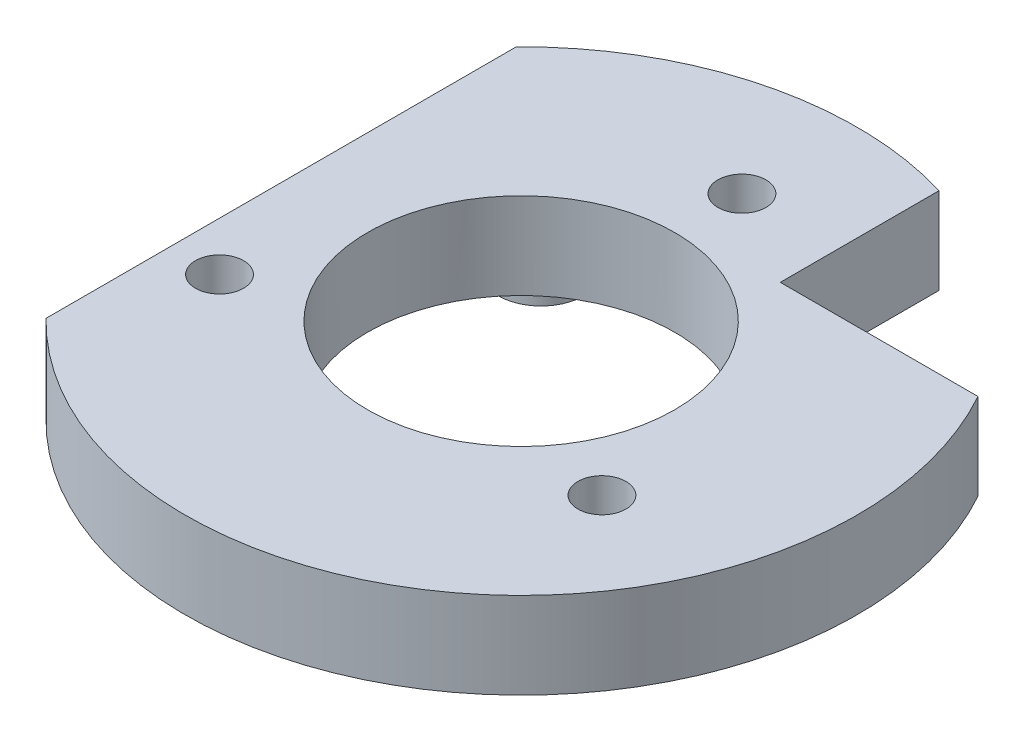
ISO-10303-21;
HEADER;
FILE_DESCRIPTION(('STEP AP214'),'2;1');
FILE_NAME('part.step','',(''),(''),'','','');
FILE_SCHEMA(('AUTOMOTIVE_DESIGN { 1 0 10303 214 1 1 1 1 }'));
ENDSEC;
DATA;
#1=APPLICATION_CONTEXT('core data for automotive mechanical design processes');
#2=APPLICATION_PROTOCOL_DEFINITION('international standard','automotive_design',2000,#1);
#3=PRODUCT_CONTEXT('',#1,'mechanical');
#4=PRODUCT('Part','Part','',(#3));
#5=PRODUCT_RELATED_PRODUCT_CATEGORY('part','',(#4));
#6=PRODUCT_DEFINITION_FORMATION('','',#4);
#7=PRODUCT_DEFINITION_CONTEXT('part definition',#1,'design');
#8=PRODUCT_DEFINITION('design','',#6,#7);
#9=PRODUCT_DEFINITION_SHAPE('','',#8);
#10=(LENGTH_UNIT() NAMED_UNIT(*) SI_UNIT(.MILLI.,.METRE.));
#11=(NAMED_UNIT(*) PLANE_ANGLE_UNIT() SI_UNIT($,.RADIAN.));
#12=(NAMED_UNIT(*) SI_UNIT($,.STERADIAN.) SOLID_ANGLE_UNIT());
#13=UNCERTAINTY_MEASURE_WITH_UNIT(LENGTH_MEASURE(1.E-05),#10,'distance_accuracy_value','');
#14=(GEOMETRIC_REPRESENTATION_CONTEXT(3) GLOBAL_UNCERTAINTY_ASSIGNED_CONTEXT((#13)) GLOBAL_UNIT_ASSIGNED_CONTEXT((#10,
#11,#12)) REPRESENTATION_CONTEXT('',''));
#15=CARTESIAN_POINT('',(0.,0.,0.));
#16=DIRECTION('',(0.,0.,1.));
#17=DIRECTION('',(1.,0.,0.));
#18=AXIS2_PLACEMENT_3D('',#15,#16,#17);
#19=CARTESIAN_POINT('',(0.,0.,0.));
#20=DIRECTION('',(0.,1.,0.));
#21=DIRECTION('',(1.,0.,0.));
#22=AXIS2_PLACEMENT_3D('',#19,#20,#21);
#23=PLANE('',#22);
#24=DIRECTION('',(0.,0.,1.));
#25=VECTOR('',#24,1.);
#26=CARTESIAN_POINT('',(-12.5,0.,-12.24744871392));
#27=LINE('',#26,#25);
#28=CARTESIAN_POINT('',(-12.5,0.,-12.24744871392));
#29=VERTEX_POINT('',#28);
#30=CARTESIAN_POINT('',(-12.5,0.,-11.29158979064));
#31=VERTEX_POINT('',#30);
#32=EDGE_CURVE('E95',#29,#31,#27,.T.);
#33=ORIENTED_EDGE('',*,*,#32,.F.);
#34=CARTESIAN_POINT('',(0.,0.,0.));
#35=DIRECTION('',(0.,1.,0.));
#36=DIRECTION('',(-0.672131147540977,0.,-0.740432117418774));
#37=AXIS2_PLACEMENT_3D('',#34,#35,#36);
#38=CIRCLE('',#37,17.5);
#39=CARTESIAN_POINT('',(-11.76229508197,0.,-12.95756205483));
#40=VERTEX_POINT('',#39);
#41=EDGE_CURVE('E36',#40,#29,#38,.T.);
#42=ORIENTED_EDGE('',*,*,#41,.F.);
#43=CARTESIAN_POINT('',(-10.25,0.,-11.29158979064));
#44=DIRECTION('',(0.,-1.,0.));
#45=DIRECTION('',(-1.,0.,0.));
#46=AXIS2_PLACEMENT_3D('',#43,#44,#45);
#47=CIRCLE('',#46,2.25);
#48=EDGE_CURVE('E125',#31,#40,#47,.T.);
#49=ORIENTED_EDGE('',*,*,#48,.F.);
#50=EDGE_LOOP('',(#33,#42,#49));
#51=FACE_BOUND('',#50,.T.);
#52=ADVANCED_FACE('F17',(#51),#23,.F.);
#53=CARTESIAN_POINT('',(0.,0.,0.));
#54=DIRECTION('',(0.,1.,0.));
#55=DIRECTION('',(1.,0.,0.));
#56=AXIS2_PLACEMENT_3D('',#53,#54,#55);
#57=PLANE('',#56);
#58=CARTESIAN_POINT('',(0.,0.,0.));
#59=DIRECTION('',(0.,1.,0.));
#60=DIRECTION('',(0.285714285714302,0.,-0.958314847499905));
#61=AXIS2_PLACEMENT_3D('',#58,#59,#60);
#62=CIRCLE('',#61,17.5);
#63=CARTESIAN_POINT('',(5.,0.,-16.77050983125));
#64=VERTEX_POINT('',#63);
#65=EDGE_CURVE('E93',#64,#40,#62,.T.);
#66=ORIENTED_EDGE('',*,*,#65,.F.);
#67=DIRECTION('',(0.,0.,-1.));
#68=VECTOR('',#67,1.);
#69=CARTESIAN_POINT('',(5.,0.,-8.5));
#70=LINE('',#69,#68);
#71=CARTESIAN_POINT('',(5.,0.,-8.5));
#72=VERTEX_POINT('',#71);
#73=EDGE_CURVE('E103',#72,#64,#70,.T.);
#74=ORIENTED_EDGE('',*,*,#73,.F.);
#75=DIRECTION('',(-1.,0.,0.));
#76=VECTOR('',#75,1.);
#77=CARTESIAN_POINT('',(15.29705854078,0.,-8.5));
#78=LINE('',#77,#76);
#79=CARTESIAN_POINT('',(15.29705854078,0.,-8.5));
#80=VERTEX_POINT('',#79);
#81=EDGE_CURVE('E106',#80,#72,#78,.T.);
#82=ORIENTED_EDGE('',*,*,#81,.F.);
#83=CARTESIAN_POINT('',(0.,0.,0.));
#84=DIRECTION('',(0.,1.,0.));
#85=DIRECTION('',(-0.71428571428569,0.,0.69985421222379));
#86=AXIS2_PLACEMENT_3D('',#83,#84,#85);
#87=CIRCLE('',#86,17.5);
#88=CARTESIAN_POINT('',(-12.5,0.,12.24744871392));
#89=VERTEX_POINT('',#88);
#90=EDGE_CURVE('E109',#89,#80,#87,.T.);
#91=ORIENTED_EDGE('',*,*,#90,.F.);
#92=DIRECTION('',(0.,0.,1.));
#93=VECTOR('',#92,1.);
#94=CARTESIAN_POINT('',(-12.5,0.,-11.29158979064));
#95=LINE('',#94,#93);
#96=EDGE_CURVE('E121',#31,#89,#95,.T.);
#97=ORIENTED_EDGE('',*,*,#96,.F.);
#98=CARTESIAN_POINT('',(-10.25,0.,-11.29158979064));
#99=DIRECTION('',(0.,-1.,0.));
#100=DIRECTION('',(1.,0.,0.));
#101=AXIS2_PLACEMENT_3D('',#98,#99,#100);
#102=CIRCLE('',#101,2.25);
#103=EDGE_CURVE('E123',#40,#31,#102,.T.);
#104=ORIENTED_EDGE('',*,*,#103,.F.);
#105=EDGE_LOOP('',(#66,#74,#82,#91,#97,#104));
#106=FACE_BOUND('',#105,.T.);
#107=CARTESIAN_POINT('',(0.,0.,0.));
#108=DIRECTION('',(0.,-1.,0.));
#109=DIRECTION('',(-1.,0.,0.));
#110=AXIS2_PLACEMENT_3D('',#107,#108,#109);
#111=CIRCLE('',#110,8.);
#112=CARTESIAN_POINT('',(-8.,0.,0.));
#113=VERTEX_POINT('',#112);
#114=EDGE_CURVE('E126',#113,#113,#111,.T.);
#115=ORIENTED_EDGE('',*,*,#114,.F.);
#116=EDGE_LOOP('',(#115));
#117=FACE_BOUND('',#116,.T.);
#118=CARTESIAN_POINT('',(0.,0.,-11.5));
#119=DIRECTION('',(0.,1.,0.));
#120=DIRECTION('',(1.,0.,0.));
#121=AXIS2_PLACEMENT_3D('',#118,#119,#120);
#122=CIRCLE('',#121,1.25);
#123=CARTESIAN_POINT('',(1.25,0.,-11.5));
#124=VERTEX_POINT('',#123);
#125=EDGE_CURVE('E11',#124,#124,#122,.T.);
#126=ORIENTED_EDGE('',*,*,#125,.T.);
#127=EDGE_LOOP('',(#126));
#128=FACE_BOUND('',#127,.T.);
#129=CARTESIAN_POINT('',(-9.959292143521,0.,5.75));
#130=DIRECTION('',(0.,1.,0.));
#131=DIRECTION('',(-0.500000000000017,0.,-0.866025403784429));
#132=AXIS2_PLACEMENT_3D('',#129,#130,#131);
#133=CIRCLE('',#132,1.25);
#134=CARTESIAN_POINT('',(-10.584292143521,0.,4.66746824526946));
#135=VERTEX_POINT('',#134);
#136=EDGE_CURVE('E27',#135,#135,#133,.T.);
#137=ORIENTED_EDGE('',*,*,#136,.T.);
#138=EDGE_LOOP('',(#137));
#139=FACE_BOUND('',#138,.T.);
#140=CARTESIAN_POINT('',(9.959292143521,0.,5.75));
#141=DIRECTION('',(0.,1.,0.));
#142=DIRECTION('',(-0.500000000000017,0.,0.866025403784429));
#143=AXIS2_PLACEMENT_3D('',#140,#141,#142);
#144=CIRCLE('',#143,1.25);
#145=CARTESIAN_POINT('',(9.33429214352098,0.,6.83253175473054));
#146=VERTEX_POINT('',#145);
#147=EDGE_CURVE('E128',#146,#146,#144,.T.);
#148=ORIENTED_EDGE('',*,*,#147,.T.);
#149=EDGE_LOOP('',(#148));
#150=FACE_BOUND('',#149,.T.);
#151=ADVANCED_FACE('F157',(#106,#117,#128,#139,#150),#57,.F.);
#152=CARTESIAN_POINT('',(0.,0.,0.));
#153=DIRECTION('',(0.,1.,0.));
#154=DIRECTION('',(1.,0.,0.));
#155=AXIS2_PLACEMENT_3D('',#152,#153,#154);
#156=CYLINDRICAL_SURFACE('',#155,8.);
#157=CARTESIAN_POINT('',(0.,4.5,0.));
#158=DIRECTION('',(0.,-1.,0.));
#159=DIRECTION('',(1.,0.,0.));
#160=AXIS2_PLACEMENT_3D('',#157,#158,#159);
#161=CIRCLE('',#160,8.);
#162=CARTESIAN_POINT('',(8.,4.5,0.));
#163=VERTEX_POINT('',#162);
#164=EDGE_CURVE('E84',#163,#163,#161,.T.);
#165=ORIENTED_EDGE('',*,*,#164,.F.);
#166=EDGE_LOOP('',(#165));
#167=FACE_BOUND('',#166,.T.);
#168=ORIENTED_EDGE('',*,*,#114,.T.);
#169=EDGE_LOOP('',(#168));
#170=FACE_BOUND('',#169,.T.);
#171=ADVANCED_FACE('F181',(#167,#170),#156,.F.);
#172=CARTESIAN_POINT('',(0.,4.5,0.));
#173=DIRECTION('',(0.,1.,0.));
#174=DIRECTION('',(1.,0.,0.));
#175=AXIS2_PLACEMENT_3D('',#172,#173,#174);
#176=PLANE('',#175);
#177=CARTESIAN_POINT('',(0.,4.5,0.));
#178=DIRECTION('',(0.,1.,0.));
#179=DIRECTION('',(-0.71428571428569,0.,0.69985421222379));
#180=AXIS2_PLACEMENT_3D('',#177,#178,#179);
#181=CIRCLE('',#180,17.5);
#182=CARTESIAN_POINT('',(-12.5,4.5,12.24744871392));
#183=VERTEX_POINT('',#182);
#184=CARTESIAN_POINT('',(15.29705854078,4.5,-8.5));
#185=VERTEX_POINT('',#184);
#186=EDGE_CURVE('E129',#183,#185,#181,.T.);
#187=ORIENTED_EDGE('',*,*,#186,.T.);
#188=DIRECTION('',(-1.,0.,0.));
#189=VECTOR('',#188,1.);
#190=CARTESIAN_POINT('',(15.29705854078,4.5,-8.5));
#191=LINE('',#190,#189);
#192=CARTESIAN_POINT('',(5.,4.5,-8.5));
#193=VERTEX_POINT('',#192);
#194=EDGE_CURVE('E138',#185,#193,#191,.T.);
#195=ORIENTED_EDGE('',*,*,#194,.T.);
#196=DIRECTION('',(0.,0.,-1.));
#197=VECTOR('',#196,1.);
#198=CARTESIAN_POINT('',(5.,4.5,-8.5));
#199=LINE('',#198,#197);
#200=CARTESIAN_POINT('',(5.,4.5,-16.77050983125));
#201=VERTEX_POINT('',#200);
#202=EDGE_CURVE('E89',#193,#201,#199,.T.);
#203=ORIENTED_EDGE('',*,*,#202,.T.);
#204=CARTESIAN_POINT('',(0.,4.5,0.));
#205=DIRECTION('',(0.,1.,0.));
#206=DIRECTION('',(0.285714285714302,0.,-0.958314847499905));
#207=AXIS2_PLACEMENT_3D('',#204,#205,#206);
#208=CIRCLE('',#207,17.5);
#209=CARTESIAN_POINT('',(-12.5,4.5,-12.24744871392));
#210=VERTEX_POINT('',#209);
#211=EDGE_CURVE('E68',#201,#210,#208,.T.);
#212=ORIENTED_EDGE('',*,*,#211,.T.);
#213=DIRECTION('',(0.,0.,1.));
#214=VECTOR('',#213,1.);
#215=CARTESIAN_POINT('',(-12.5,4.5,-12.24744871392));
#216=LINE('',#215,#214);
#217=EDGE_CURVE('E74',#210,#183,#216,.T.);
#218=ORIENTED_EDGE('',*,*,#217,.T.);
#219=EDGE_LOOP('',(#187,#195,#203,#212,#218));
#220=FACE_BOUND('',#219,.T.);
#221=ORIENTED_EDGE('',*,*,#164,.T.);
#222=EDGE_LOOP('',(#221));
#223=FACE_BOUND('',#222,.T.);
#224=CARTESIAN_POINT('',(0.,4.5,-11.5));
#225=DIRECTION('',(0.,1.,0.));
#226=DIRECTION('',(1.,0.,0.));
#227=AXIS2_PLACEMENT_3D('',#224,#225,#226);
#228=CIRCLE('',#227,1.25);
#229=CARTESIAN_POINT('',(1.25,4.5,-11.5));
#230=VERTEX_POINT('',#229);
#231=EDGE_CURVE('E113',#230,#230,#228,.T.);
#232=ORIENTED_EDGE('',*,*,#231,.F.);
#233=EDGE_LOOP('',(#232));
#234=FACE_BOUND('',#233,.T.);
#235=CARTESIAN_POINT('',(-9.959292143521,4.5,5.75));
#236=DIRECTION('',(0.,1.,0.));
#237=DIRECTION('',(-0.500000000000017,0.,-0.866025403784429));
#238=AXIS2_PLACEMENT_3D('',#235,#236,#237);
#239=CIRCLE('',#238,1.25);
#240=CARTESIAN_POINT('',(-10.584292143521,4.5,4.66746824526946));
#241=VERTEX_POINT('',#240);
#242=EDGE_CURVE('E117',#241,#241,#239,.T.);
#243=ORIENTED_EDGE('',*,*,#242,.F.);
#244=EDGE_LOOP('',(#243));
#245=FACE_BOUND('',#244,.T.);
#246=CARTESIAN_POINT('',(9.959292143521,4.5,5.75));
#247=DIRECTION('',(0.,1.,0.));
#248=DIRECTION('',(-0.500000000000017,0.,0.866025403784429));
#249=AXIS2_PLACEMENT_3D('',#246,#247,#248);
#250=CIRCLE('',#249,1.25);
#251=CARTESIAN_POINT('',(9.33429214352098,4.5,6.83253175473054));
#252=VERTEX_POINT('',#251);
#253=EDGE_CURVE('E142',#252,#252,#250,.T.);
#254=ORIENTED_EDGE('',*,*,#253,.F.);
#255=EDGE_LOOP('',(#254));
#256=FACE_BOUND('',#255,.T.);
#257=ADVANCED_FACE('F86',(#220,#223,#234,#245,#256),#176,.T.);
#258=CARTESIAN_POINT('',(-12.5,0.,-12.24744871392));
#259=DIRECTION('',(-1.,0.,0.));
#260=DIRECTION('',(0.,0.,1.));
#261=AXIS2_PLACEMENT_3D('',#258,#259,#260);
#262=PLANE('',#261);
#263=ORIENTED_EDGE('',*,*,#96,.T.);
#264=DIRECTION('',(0.,1.,0.));
#265=VECTOR('',#264,1.);
#266=CARTESIAN_POINT('',(-12.5,0.,12.24744871392));
#267=LINE('',#266,#265);
#268=EDGE_CURVE('E80',#89,#183,#267,.T.);
#269=ORIENTED_EDGE('',*,*,#268,.T.);
#270=ORIENTED_EDGE('',*,*,#217,.F.);
#271=DIRECTION('',(0.,1.,0.));
#272=VECTOR('',#271,1.);
#273=CARTESIAN_POINT('',(-12.5,0.,-12.24744871392));
#274=LINE('',#273,#272);
#275=EDGE_CURVE('E78',#29,#210,#274,.T.);
#276=ORIENTED_EDGE('',*,*,#275,.F.);
#277=ORIENTED_EDGE('',*,*,#32,.T.);
#278=EDGE_LOOP('',(#263,#269,#270,#276,#277));
#279=FACE_BOUND('',#278,.T.);
#280=ADVANCED_FACE('F76',(#279),#262,.T.);
#281=CARTESIAN_POINT('',(0.,0.,0.));
#282=DIRECTION('',(0.,1.,0.));
#283=DIRECTION('',(1.,0.,0.));
#284=AXIS2_PLACEMENT_3D('',#281,#282,#283);
#285=CYLINDRICAL_SURFACE('',#284,17.5);
#286=ORIENTED_EDGE('',*,*,#41,.T.);
#287=ORIENTED_EDGE('',*,*,#275,.T.);
#288=ORIENTED_EDGE('',*,*,#211,.F.);
#289=DIRECTION('',(0.,1.,0.));
#290=VECTOR('',#289,1.);
#291=CARTESIAN_POINT('',(5.,0.,-16.77050983125));
#292=LINE('',#291,#290);
#293=EDGE_CURVE('E97',#64,#201,#292,.T.);
#294=ORIENTED_EDGE('',*,*,#293,.F.);
#295=ORIENTED_EDGE('',*,*,#65,.T.);
#296=EDGE_LOOP('',(#286,#287,#288,#294,#295));
#297=FACE_BOUND('',#296,.T.);
#298=ADVANCED_FACE('F92',(#297),#285,.T.);
#299=CARTESIAN_POINT('',(5.,0.,-8.5));
#300=DIRECTION('',(1.,0.,0.));
#301=DIRECTION('',(0.,0.,-1.));
#302=AXIS2_PLACEMENT_3D('',#299,#300,#301);
#303=PLANE('',#302);
#304=ORIENTED_EDGE('',*,*,#293,.T.);
#305=ORIENTED_EDGE('',*,*,#202,.F.);
#306=DIRECTION('',(0.,1.,0.));
#307=VECTOR('',#306,1.);
#308=CARTESIAN_POINT('',(5.,0.,-8.5));
#309=LINE('',#308,#307);
#310=EDGE_CURVE('E104',#72,#193,#309,.T.);
#311=ORIENTED_EDGE('',*,*,#310,.F.);
#312=ORIENTED_EDGE('',*,*,#73,.T.);
#313=EDGE_LOOP('',(#304,#305,#311,#312));
#314=FACE_BOUND('',#313,.T.);
#315=ADVANCED_FACE('F155',(#314),#303,.T.);
#316=CARTESIAN_POINT('',(15.29705854078,0.,-8.5));
#317=DIRECTION('',(0.,0.,-1.));
#318=DIRECTION('',(-1.,0.,0.));
#319=AXIS2_PLACEMENT_3D('',#316,#317,#318);
#320=PLANE('',#319);
#321=ORIENTED_EDGE('',*,*,#310,.T.);
#322=ORIENTED_EDGE('',*,*,#194,.F.);
#323=DIRECTION('',(0.,1.,0.));
#324=VECTOR('',#323,1.);
#325=CARTESIAN_POINT('',(15.29705854078,0.,-8.5));
#326=LINE('',#325,#324);
#327=EDGE_CURVE('E107',#80,#185,#326,.T.);
#328=ORIENTED_EDGE('',*,*,#327,.F.);
#329=ORIENTED_EDGE('',*,*,#81,.T.);
#330=EDGE_LOOP('',(#321,#322,#328,#329));
#331=FACE_BOUND('',#330,.T.);
#332=ADVANCED_FACE('F162',(#331),#320,.T.);
#333=CARTESIAN_POINT('',(0.,0.,0.));
#334=DIRECTION('',(0.,1.,0.));
#335=DIRECTION('',(1.,0.,0.));
#336=AXIS2_PLACEMENT_3D('',#333,#334,#335);
#337=CYLINDRICAL_SURFACE('',#336,17.5);
#338=ORIENTED_EDGE('',*,*,#327,.T.);
#339=ORIENTED_EDGE('',*,*,#186,.F.);
#340=ORIENTED_EDGE('',*,*,#268,.F.);
#341=ORIENTED_EDGE('',*,*,#90,.T.);
#342=EDGE_LOOP('',(#338,#339,#340,#341));
#343=FACE_BOUND('',#342,.T.);
#344=ADVANCED_FACE('F163',(#343),#337,.T.);
#345=CARTESIAN_POINT('',(0.,0.,-11.5));
#346=DIRECTION('',(0.,1.,0.));
#347=DIRECTION('',(-1.,0.,0.));
#348=AXIS2_PLACEMENT_3D('',#345,#346,#347);
#349=CYLINDRICAL_SURFACE('',#348,1.25);
#350=ORIENTED_EDGE('',*,*,#231,.T.);
#351=EDGE_LOOP('',(#350));
#352=FACE_BOUND('',#351,.T.);
#353=ORIENTED_EDGE('',*,*,#125,.F.);
#354=EDGE_LOOP('',(#353));
#355=FACE_BOUND('',#354,.T.);
#356=ADVANCED_FACE('F165',(#352,#355),#349,.F.);
#357=CARTESIAN_POINT('',(-9.959292143521,0.,5.75));
#358=DIRECTION('',(0.,1.,0.));
#359=DIRECTION('',(0.500000000000017,0.,0.866025403784429));
#360=AXIS2_PLACEMENT_3D('',#357,#358,#359);
#361=CYLINDRICAL_SURFACE('',#360,1.25);
#362=ORIENTED_EDGE('',*,*,#242,.T.);
#363=EDGE_LOOP('',(#362));
#364=FACE_BOUND('',#363,.T.);
#365=ORIENTED_EDGE('',*,*,#136,.F.);
#366=EDGE_LOOP('',(#365));
#367=FACE_BOUND('',#366,.T.);
#368=ADVANCED_FACE('F172',(#364,#367),#361,.F.);
#369=CARTESIAN_POINT('',(9.959292143521,0.,5.75));
#370=DIRECTION('',(0.,1.,0.));
#371=DIRECTION('',(0.500000000000017,0.,-0.866025403784429));
#372=AXIS2_PLACEMENT_3D('',#369,#370,#371);
#373=CYLINDRICAL_SURFACE('',#372,1.25);
#374=ORIENTED_EDGE('',*,*,#253,.T.);
#375=EDGE_LOOP('',(#374));
#376=FACE_BOUND('',#375,.T.);
#377=ORIENTED_EDGE('',*,*,#147,.F.);
#378=EDGE_LOOP('',(#377));
#379=FACE_BOUND('',#378,.T.);
#380=ADVANCED_FACE('F226',(#376,#379),#373,.F.);
#381=CARTESIAN_POINT('',(-10.25,0.,-11.29158979064));
#382=DIRECTION('',(0.,-1.,0.));
#383=DIRECTION('',(-1.,0.,0.));
#384=AXIS2_PLACEMENT_3D('',#381,#382,#383);
#385=CYLINDRICAL_SURFACE('',#384,2.25);
#386=CARTESIAN_POINT('',(-10.25,-4.,-11.29158979064));
#387=DIRECTION('',(0.,-1.,0.));
#388=DIRECTION('',(-1.,0.,0.));
#389=AXIS2_PLACEMENT_3D('',#386,#387,#388);
#390=CIRCLE('',#389,2.25);
#391=CARTESIAN_POINT('',(-12.5,-4.,-11.29158979064));
#392=VERTEX_POINT('',#391);
#393=EDGE_CURVE('E21',#392,#392,#390,.T.);
#394=ORIENTED_EDGE('',*,*,#393,.F.);
#395=EDGE_LOOP('',(#394));
#396=FACE_BOUND('',#395,.T.);
#397=ORIENTED_EDGE('',*,*,#48,.T.);
#398=ORIENTED_EDGE('',*,*,#103,.T.);
#399=EDGE_LOOP('',(#397,#398));
#400=FACE_BOUND('',#399,.T.);
#401=ADVANCED_FACE('F236',(#396,#400),#385,.T.);
#402=CARTESIAN_POINT('',(0.,-4.,0.));
#403=DIRECTION('',(0.,-1.,0.));
#404=DIRECTION('',(-1.,0.,0.));
#405=AXIS2_PLACEMENT_3D('',#402,#403,#404);
#406=PLANE('',#405);
#407=ORIENTED_EDGE('',*,*,#393,.T.);
#408=EDGE_LOOP('',(#407));
#409=FACE_BOUND('',#408,.T.);
#410=ADVANCED_FACE('F19',(#409),#406,.T.);
#411=CLOSED_SHELL('',(#52,#151,#171,#257,#280,#298,#315,#332,#344,#356,#368,#380,#401,#410));
#412=MANIFOLD_SOLID_BREP('B1',#411);
#413=ADVANCED_BREP_SHAPE_REPRESENTATION('',(#18,#412),#14);
#414=SHAPE_DEFINITION_REPRESENTATION(#9,#413);
ENDSEC;
END-ISO-10303-21;
